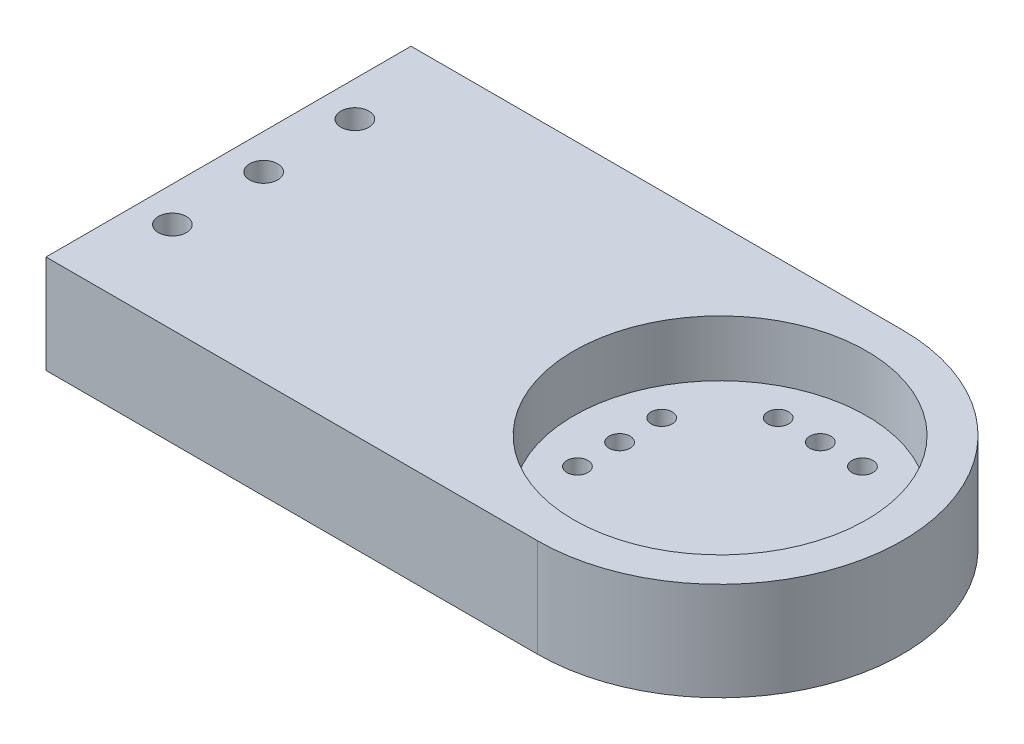
ISO-10303-21;
HEADER;
FILE_DESCRIPTION(('STEP AP214'),'2;1');
FILE_NAME('part.step','',(''),(''),'','','');
FILE_SCHEMA(('AUTOMOTIVE_DESIGN { 1 0 10303 214 1 1 1 1 }'));
ENDSEC;
DATA;
#1=APPLICATION_CONTEXT('core data for automotive mechanical design processes');
#2=APPLICATION_PROTOCOL_DEFINITION('international standard','automotive_design',2000,#1);
#3=PRODUCT_CONTEXT('',#1,'mechanical');
#4=PRODUCT('Part','Part','',(#3));
#5=PRODUCT_RELATED_PRODUCT_CATEGORY('part','',(#4));
#6=PRODUCT_DEFINITION_FORMATION('','',#4);
#7=PRODUCT_DEFINITION_CONTEXT('part definition',#1,'design');
#8=PRODUCT_DEFINITION('design','',#6,#7);
#9=PRODUCT_DEFINITION_SHAPE('','',#8);
#10=(LENGTH_UNIT() NAMED_UNIT(*) SI_UNIT(.MILLI.,.METRE.));
#11=(NAMED_UNIT(*) PLANE_ANGLE_UNIT() SI_UNIT($,.RADIAN.));
#12=(NAMED_UNIT(*) SI_UNIT($,.STERADIAN.) SOLID_ANGLE_UNIT());
#13=UNCERTAINTY_MEASURE_WITH_UNIT(LENGTH_MEASURE(1.E-05),#10,'distance_accuracy_value','');
#14=(GEOMETRIC_REPRESENTATION_CONTEXT(3) GLOBAL_UNCERTAINTY_ASSIGNED_CONTEXT((#13)) GLOBAL_UNIT_ASSIGNED_CONTEXT((#10,
#11,#12)) REPRESENTATION_CONTEXT('',''));
#15=CARTESIAN_POINT('',(0.,0.,0.));
#16=DIRECTION('',(0.,0.,1.));
#17=DIRECTION('',(1.,0.,0.));
#18=AXIS2_PLACEMENT_3D('',#15,#16,#17);
#19=CARTESIAN_POINT('',(0.,0.,0.));
#20=DIRECTION('',(0.,1.,0.));
#21=DIRECTION('',(0.,0.,1.));
#22=AXIS2_PLACEMENT_3D('',#19,#20,#21);
#23=PLANE('',#22);
#24=CARTESIAN_POINT('',(35.,0.,-5.85));
#25=DIRECTION('',(0.,-1.,0.));
#26=DIRECTION('',(0.,0.,-1.));
#27=AXIS2_PLACEMENT_3D('',#24,#25,#26);
#28=CIRCLE('',#27,0.750000000000001);
#29=CARTESIAN_POINT('',(35.,0.,-6.6));
#30=VERTEX_POINT('',#29);
#31=EDGE_CURVE('E439',#30,#30,#28,.T.);
#32=ORIENTED_EDGE('',*,*,#31,.F.);
#33=EDGE_LOOP('',(#32));
#34=FACE_BOUND('',#33,.T.);
#35=CARTESIAN_POINT('',(38.,0.,-5.85));
#36=DIRECTION('',(0.,-1.,0.));
#37=DIRECTION('',(0.,0.,-1.));
#38=AXIS2_PLACEMENT_3D('',#35,#36,#37);
#39=CIRCLE('',#38,0.750000000000001);
#40=CARTESIAN_POINT('',(38.,0.,-6.6));
#41=VERTEX_POINT('',#40);
#42=EDGE_CURVE('E143',#41,#41,#39,.T.);
#43=ORIENTED_EDGE('',*,*,#42,.F.);
#44=EDGE_LOOP('',(#43));
#45=FACE_BOUND('',#44,.T.);
#46=CARTESIAN_POINT('',(32.,0.,-5.85));
#47=DIRECTION('',(0.,-1.,0.));
#48=DIRECTION('',(0.,0.,-1.));
#49=AXIS2_PLACEMENT_3D('',#46,#47,#48);
#50=CIRCLE('',#49,0.750000000000001);
#51=CARTESIAN_POINT('',(32.,0.,-6.6));
#52=VERTEX_POINT('',#51);
#53=EDGE_CURVE('E132',#52,#52,#50,.T.);
#54=ORIENTED_EDGE('',*,*,#53,.F.);
#55=EDGE_LOOP('',(#54));
#56=FACE_BOUND('',#55,.T.);
#57=CARTESIAN_POINT('',(27.85,0.,-10.));
#58=DIRECTION('',(0.,-1.,0.));
#59=DIRECTION('',(0.,0.,-1.));
#60=AXIS2_PLACEMENT_3D('',#57,#58,#59);
#61=CIRCLE('',#60,0.750000000000001);
#62=CARTESIAN_POINT('',(27.85,0.,-10.75));
#63=VERTEX_POINT('',#62);
#64=EDGE_CURVE('E131',#63,#63,#61,.T.);
#65=ORIENTED_EDGE('',*,*,#64,.F.);
#66=EDGE_LOOP('',(#65));
#67=FACE_BOUND('',#66,.T.);
#68=CARTESIAN_POINT('',(27.85,0.,-13.));
#69=DIRECTION('',(0.,-1.,0.));
#70=DIRECTION('',(0.,0.,-1.));
#71=AXIS2_PLACEMENT_3D('',#68,#69,#70);
#72=CIRCLE('',#71,0.750000000000001);
#73=CARTESIAN_POINT('',(27.85,0.,-13.75));
#74=VERTEX_POINT('',#73);
#75=EDGE_CURVE('E149',#74,#74,#72,.T.);
#76=ORIENTED_EDGE('',*,*,#75,.F.);
#77=EDGE_LOOP('',(#76));
#78=FACE_BOUND('',#77,.T.);
#79=CARTESIAN_POINT('',(27.85,0.,-16.));
#80=DIRECTION('',(0.,-1.,0.));
#81=DIRECTION('',(0.,0.,-1.));
#82=AXIS2_PLACEMENT_3D('',#79,#80,#81);
#83=CIRCLE('',#82,0.750000000000001);
#84=CARTESIAN_POINT('',(27.85,0.,-16.75));
#85=VERTEX_POINT('',#84);
#86=EDGE_CURVE('E155',#85,#85,#83,.T.);
#87=ORIENTED_EDGE('',*,*,#86,.F.);
#88=EDGE_LOOP('',(#87));
#89=FACE_BOUND('',#88,.T.);
#90=CARTESIAN_POINT('',(42.15,0.,-13.));
#91=DIRECTION('',(0.,-1.,0.));
#92=DIRECTION('',(0.,0.,-1.));
#93=AXIS2_PLACEMENT_3D('',#90,#91,#92);
#94=CIRCLE('',#93,0.750000000000001);
#95=CARTESIAN_POINT('',(42.15,0.,-13.75));
#96=VERTEX_POINT('',#95);
#97=EDGE_CURVE('E127',#96,#96,#94,.T.);
#98=ORIENTED_EDGE('',*,*,#97,.F.);
#99=EDGE_LOOP('',(#98));
#100=FACE_BOUND('',#99,.T.);
#101=CARTESIAN_POINT('',(42.15,0.,-16.));
#102=DIRECTION('',(0.,-1.,0.));
#103=DIRECTION('',(0.,0.,-1.));
#104=AXIS2_PLACEMENT_3D('',#101,#102,#103);
#105=CIRCLE('',#104,0.750000000000001);
#106=CARTESIAN_POINT('',(42.15,0.,-16.75));
#107=VERTEX_POINT('',#106);
#108=EDGE_CURVE('E168',#107,#107,#105,.T.);
#109=ORIENTED_EDGE('',*,*,#108,.F.);
#110=EDGE_LOOP('',(#109));
#111=FACE_BOUND('',#110,.T.);
#112=CARTESIAN_POINT('',(35.,0.,-20.15));
#113=DIRECTION('',(0.,-1.,0.));
#114=DIRECTION('',(0.,0.,-1.));
#115=AXIS2_PLACEMENT_3D('',#112,#113,#114);
#116=CIRCLE('',#115,0.750000000000001);
#117=CARTESIAN_POINT('',(35.,0.,-20.9));
#118=VERTEX_POINT('',#117);
#119=EDGE_CURVE('E174',#118,#118,#116,.T.);
#120=ORIENTED_EDGE('',*,*,#119,.F.);
#121=EDGE_LOOP('',(#120));
#122=FACE_BOUND('',#121,.T.);
#123=CARTESIAN_POINT('',(32.,0.,-20.15));
#124=DIRECTION('',(0.,-1.,0.));
#125=DIRECTION('',(0.,0.,-1.));
#126=AXIS2_PLACEMENT_3D('',#123,#124,#125);
#127=CIRCLE('',#126,0.750000000000001);
#128=CARTESIAN_POINT('',(32.,0.,-20.9));
#129=VERTEX_POINT('',#128);
#130=EDGE_CURVE('E180',#129,#129,#127,.T.);
#131=ORIENTED_EDGE('',*,*,#130,.F.);
#132=EDGE_LOOP('',(#131));
#133=FACE_BOUND('',#132,.T.);
#134=CARTESIAN_POINT('',(38.,0.,-20.15));
#135=DIRECTION('',(0.,-1.,0.));
#136=DIRECTION('',(0.,0.,-1.));
#137=AXIS2_PLACEMENT_3D('',#134,#135,#136);
#138=CIRCLE('',#137,0.750000000000001);
#139=CARTESIAN_POINT('',(38.,0.,-20.9));
#140=VERTEX_POINT('',#139);
#141=EDGE_CURVE('E186',#140,#140,#138,.T.);
#142=ORIENTED_EDGE('',*,*,#141,.F.);
#143=EDGE_LOOP('',(#142));
#144=FACE_BOUND('',#143,.T.);
#145=CARTESIAN_POINT('',(2.5,0.,-6.5));
#146=DIRECTION('',(0.,-1.,0.));
#147=DIRECTION('',(0.,0.,-1.));
#148=AXIS2_PLACEMENT_3D('',#145,#146,#147);
#149=CIRCLE('',#148,0.999999999999989);
#150=CARTESIAN_POINT('',(2.5,0.,-7.49999999999999));
#151=VERTEX_POINT('',#150);
#152=EDGE_CURVE('E192',#151,#151,#149,.T.);
#153=ORIENTED_EDGE('',*,*,#152,.F.);
#154=EDGE_LOOP('',(#153));
#155=FACE_BOUND('',#154,.T.);
#156=CARTESIAN_POINT('',(2.5,0.,-13.));
#157=DIRECTION('',(0.,-1.,0.));
#158=DIRECTION('',(0.,0.,-1.));
#159=AXIS2_PLACEMENT_3D('',#156,#157,#158);
#160=CIRCLE('',#159,0.999999999999989);
#161=CARTESIAN_POINT('',(2.5,0.,-14.));
#162=VERTEX_POINT('',#161);
#163=EDGE_CURVE('E198',#162,#162,#160,.T.);
#164=ORIENTED_EDGE('',*,*,#163,.F.);
#165=EDGE_LOOP('',(#164));
#166=FACE_BOUND('',#165,.T.);
#167=CARTESIAN_POINT('',(2.5,0.,-19.5));
#168=DIRECTION('',(0.,-1.,0.));
#169=DIRECTION('',(0.,0.,-1.));
#170=AXIS2_PLACEMENT_3D('',#167,#168,#169);
#171=CIRCLE('',#170,0.999999999999989);
#172=CARTESIAN_POINT('',(2.5,0.,-20.5));
#173=VERTEX_POINT('',#172);
#174=EDGE_CURVE('E204',#173,#173,#171,.T.);
#175=ORIENTED_EDGE('',*,*,#174,.F.);
#176=EDGE_LOOP('',(#175));
#177=FACE_BOUND('',#176,.T.);
#178=DIRECTION('',(1.,0.,0.));
#179=VECTOR('',#178,1.);
#180=CARTESIAN_POINT('',(0.,0.,0.));
#181=LINE('',#180,#179);
#182=CARTESIAN_POINT('',(0.,0.,0.));
#183=VERTEX_POINT('',#182);
#184=CARTESIAN_POINT('',(35.,0.,0.));
#185=VERTEX_POINT('',#184);
#186=EDGE_CURVE('E114',#183,#185,#181,.T.);
#187=ORIENTED_EDGE('',*,*,#186,.F.);
#188=DIRECTION('',(0.,0.,-1.));
#189=VECTOR('',#188,1.);
#190=CARTESIAN_POINT('',(0.,0.,0.));
#191=LINE('',#190,#189);
#192=CARTESIAN_POINT('',(0.,0.,-26.));
#193=VERTEX_POINT('',#192);
#194=EDGE_CURVE('E120',#183,#193,#191,.T.);
#195=ORIENTED_EDGE('',*,*,#194,.T.);
#196=DIRECTION('',(1.,0.,0.));
#197=VECTOR('',#196,1.);
#198=CARTESIAN_POINT('',(0.,0.,-26.));
#199=LINE('',#198,#197);
#200=CARTESIAN_POINT('',(35.,0.,-26.));
#201=VERTEX_POINT('',#200);
#202=EDGE_CURVE('E118',#193,#201,#199,.T.);
#203=ORIENTED_EDGE('',*,*,#202,.T.);
#204=CARTESIAN_POINT('',(35.,0.,-13.));
#205=DIRECTION('',(0.,1.,0.));
#206=DIRECTION('',(0.,0.,1.));
#207=AXIS2_PLACEMENT_3D('',#204,#205,#206);
#208=CIRCLE('',#207,13.);
#209=EDGE_CURVE('E104',#185,#201,#208,.T.);
#210=ORIENTED_EDGE('',*,*,#209,.F.);
#211=EDGE_LOOP('',(#187,#195,#203,#210));
#212=FACE_BOUND('',#211,.T.);
#213=CARTESIAN_POINT('',(42.15,0.,-10.));
#214=DIRECTION('',(0.,-1.,0.));
#215=DIRECTION('',(0.,0.,-1.));
#216=AXIS2_PLACEMENT_3D('',#213,#214,#215);
#217=CIRCLE('',#216,0.750000000000001);
#218=CARTESIAN_POINT('',(42.15,0.,-10.75));
#219=VERTEX_POINT('',#218);
#220=EDGE_CURVE('E128',#219,#219,#217,.T.);
#221=ORIENTED_EDGE('',*,*,#220,.F.);
#222=EDGE_LOOP('',(#221));
#223=FACE_BOUND('',#222,.T.);
#224=ADVANCED_FACE('F47',(#34,#45,#56,#67,#78,#89,#100,#111,#122,#133,#144,#155,#166,#177,#212,
#223),#23,.F.);
#225=CARTESIAN_POINT('',(0.,7.,0.));
#226=DIRECTION('',(0.,0.,-1.));
#227=DIRECTION('',(-1.,0.,0.));
#228=AXIS2_PLACEMENT_3D('',#225,#226,#227);
#229=PLANE('',#228);
#230=ORIENTED_EDGE('',*,*,#186,.T.);
#231=DIRECTION('',(0.,-1.,0.));
#232=VECTOR('',#231,1.);
#233=CARTESIAN_POINT('',(35.,7.,0.));
#234=LINE('',#233,#232);
#235=CARTESIAN_POINT('',(35.,7.,0.));
#236=VERTEX_POINT('',#235);
#237=EDGE_CURVE('E11',#236,#185,#234,.T.);
#238=ORIENTED_EDGE('',*,*,#237,.F.);
#239=DIRECTION('',(1.,0.,0.));
#240=VECTOR('',#239,1.);
#241=CARTESIAN_POINT('',(0.,7.,0.));
#242=LINE('',#241,#240);
#243=CARTESIAN_POINT('',(0.,7.,0.));
#244=VERTEX_POINT('',#243);
#245=EDGE_CURVE('E99',#244,#236,#242,.T.);
#246=ORIENTED_EDGE('',*,*,#245,.F.);
#247=DIRECTION('',(0.,-1.,0.));
#248=VECTOR('',#247,1.);
#249=CARTESIAN_POINT('',(0.,7.,0.));
#250=LINE('',#249,#248);
#251=EDGE_CURVE('E66',#244,#183,#250,.T.);
#252=ORIENTED_EDGE('',*,*,#251,.T.);
#253=EDGE_LOOP('',(#230,#238,#246,#252));
#254=FACE_BOUND('',#253,.T.);
#255=ADVANCED_FACE('F49',(#254),#229,.F.);
#256=CARTESIAN_POINT('',(35.,7.,-13.));
#257=DIRECTION('',(0.,-1.,0.));
#258=DIRECTION('',(0.,0.,-1.));
#259=AXIS2_PLACEMENT_3D('',#256,#257,#258);
#260=CYLINDRICAL_SURFACE('',#259,13.);
#261=ORIENTED_EDGE('',*,*,#209,.T.);
#262=DIRECTION('',(0.,-1.,0.));
#263=VECTOR('',#262,1.);
#264=CARTESIAN_POINT('',(35.,7.,-26.));
#265=LINE('',#264,#263);
#266=CARTESIAN_POINT('',(35.,7.,-26.));
#267=VERTEX_POINT('',#266);
#268=EDGE_CURVE('E57',#267,#201,#265,.T.);
#269=ORIENTED_EDGE('',*,*,#268,.F.);
#270=CARTESIAN_POINT('',(35.,7.,-13.));
#271=DIRECTION('',(0.,1.,0.));
#272=DIRECTION('',(0.,0.,1.));
#273=AXIS2_PLACEMENT_3D('',#270,#271,#272);
#274=CIRCLE('',#273,13.);
#275=EDGE_CURVE('E91',#236,#267,#274,.T.);
#276=ORIENTED_EDGE('',*,*,#275,.F.);
#277=ORIENTED_EDGE('',*,*,#237,.T.);
#278=EDGE_LOOP('',(#261,#269,#276,#277));
#279=FACE_BOUND('',#278,.T.);
#280=ADVANCED_FACE('F103',(#279),#260,.T.);
#281=CARTESIAN_POINT('',(0.,7.,-26.));
#282=DIRECTION('',(0.,0.,-1.));
#283=DIRECTION('',(-1.,0.,0.));
#284=AXIS2_PLACEMENT_3D('',#281,#282,#283);
#285=PLANE('',#284);
#286=ORIENTED_EDGE('',*,*,#202,.F.);
#287=DIRECTION('',(0.,-1.,0.));
#288=VECTOR('',#287,1.);
#289=CARTESIAN_POINT('',(0.,7.,-26.));
#290=LINE('',#289,#288);
#291=CARTESIAN_POINT('',(0.,7.,-26.));
#292=VERTEX_POINT('',#291);
#293=EDGE_CURVE('E80',#292,#193,#290,.T.);
#294=ORIENTED_EDGE('',*,*,#293,.F.);
#295=DIRECTION('',(1.,0.,0.));
#296=VECTOR('',#295,1.);
#297=CARTESIAN_POINT('',(0.,7.,-26.));
#298=LINE('',#297,#296);
#299=EDGE_CURVE('E98',#292,#267,#298,.T.);
#300=ORIENTED_EDGE('',*,*,#299,.T.);
#301=ORIENTED_EDGE('',*,*,#268,.T.);
#302=EDGE_LOOP('',(#286,#294,#300,#301));
#303=FACE_BOUND('',#302,.T.);
#304=ADVANCED_FACE('F108',(#303),#285,.T.);
#305=CARTESIAN_POINT('',(0.,7.,0.));
#306=DIRECTION('',(-1.,0.,0.));
#307=DIRECTION('',(0.,0.,1.));
#308=AXIS2_PLACEMENT_3D('',#305,#306,#307);
#309=PLANE('',#308);
#310=ORIENTED_EDGE('',*,*,#194,.F.);
#311=ORIENTED_EDGE('',*,*,#251,.F.);
#312=DIRECTION('',(0.,0.,-1.));
#313=VECTOR('',#312,1.);
#314=CARTESIAN_POINT('',(0.,7.,0.));
#315=LINE('',#314,#313);
#316=EDGE_CURVE('E109',#244,#292,#315,.T.);
#317=ORIENTED_EDGE('',*,*,#316,.T.);
#318=ORIENTED_EDGE('',*,*,#293,.T.);
#319=EDGE_LOOP('',(#310,#311,#317,#318));
#320=FACE_BOUND('',#319,.T.);
#321=ADVANCED_FACE('F219',(#320),#309,.T.);
#322=CARTESIAN_POINT('',(0.,7.,0.));
#323=DIRECTION('',(0.,1.,0.));
#324=DIRECTION('',(0.,0.,1.));
#325=AXIS2_PLACEMENT_3D('',#322,#323,#324);
#326=PLANE('',#325);
#327=CARTESIAN_POINT('',(2.5,6.99999999999999,-6.5));
#328=DIRECTION('',(0.,-1.,0.));
#329=DIRECTION('',(0.,0.,-1.));
#330=AXIS2_PLACEMENT_3D('',#327,#328,#329);
#331=CIRCLE('',#330,0.999999999999987);
#332=CARTESIAN_POINT('',(2.5,6.99999999999999,-7.49999999999999));
#333=VERTEX_POINT('',#332);
#334=EDGE_CURVE('E195',#333,#333,#331,.T.);
#335=ORIENTED_EDGE('',*,*,#334,.T.);
#336=EDGE_LOOP('',(#335));
#337=FACE_BOUND('',#336,.T.);
#338=CARTESIAN_POINT('',(2.5,6.99999999999999,-13.));
#339=DIRECTION('',(0.,-1.,0.));
#340=DIRECTION('',(0.,0.,-1.));
#341=AXIS2_PLACEMENT_3D('',#338,#339,#340);
#342=CIRCLE('',#341,0.999999999999987);
#343=CARTESIAN_POINT('',(2.5,6.99999999999999,-14.));
#344=VERTEX_POINT('',#343);
#345=EDGE_CURVE('E201',#344,#344,#342,.T.);
#346=ORIENTED_EDGE('',*,*,#345,.T.);
#347=EDGE_LOOP('',(#346));
#348=FACE_BOUND('',#347,.T.);
#349=CARTESIAN_POINT('',(2.5,6.99999999999999,-19.5));
#350=DIRECTION('',(0.,-1.,0.));
#351=DIRECTION('',(0.,0.,-1.));
#352=AXIS2_PLACEMENT_3D('',#349,#350,#351);
#353=CIRCLE('',#352,0.999999999999987);
#354=CARTESIAN_POINT('',(2.5,6.99999999999999,-20.5));
#355=VERTEX_POINT('',#354);
#356=EDGE_CURVE('E207',#355,#355,#353,.T.);
#357=ORIENTED_EDGE('',*,*,#356,.T.);
#358=EDGE_LOOP('',(#357));
#359=FACE_BOUND('',#358,.T.);
#360=CARTESIAN_POINT('',(35.0112333506112,7.,-13.0014825212493));
#361=DIRECTION('',(0.,1.,0.));
#362=DIRECTION('',(0.,0.,1.));
#363=AXIS2_PLACEMENT_3D('',#360,#361,#362);
#364=CIRCLE('',#363,10.425);
#365=CARTESIAN_POINT('',(35.0112333506112,7.,-2.57648252124927));
#366=VERTEX_POINT('',#365);
#367=EDGE_CURVE('E210',#366,#366,#364,.T.);
#368=ORIENTED_EDGE('',*,*,#367,.F.);
#369=EDGE_LOOP('',(#368));
#370=FACE_BOUND('',#369,.T.);
#371=ORIENTED_EDGE('',*,*,#245,.T.);
#372=ORIENTED_EDGE('',*,*,#275,.T.);
#373=ORIENTED_EDGE('',*,*,#299,.F.);
#374=ORIENTED_EDGE('',*,*,#316,.F.);
#375=EDGE_LOOP('',(#371,#372,#373,#374));
#376=FACE_BOUND('',#375,.T.);
#377=ADVANCED_FACE('F95',(#337,#348,#359,#370,#376),#326,.T.);
#378=CARTESIAN_POINT('',(35.0112333506112,3.,-13.0014825212493));
#379=DIRECTION('',(0.,1.,0.));
#380=DIRECTION('',(0.,0.,1.));
#381=AXIS2_PLACEMENT_3D('',#378,#379,#380);
#382=CYLINDRICAL_SURFACE('',#381,10.425);
#383=CARTESIAN_POINT('',(35.0112333506112,3.,-13.0014825212493));
#384=DIRECTION('',(0.,1.,0.));
#385=DIRECTION('',(0.,0.,1.));
#386=AXIS2_PLACEMENT_3D('',#383,#384,#385);
#387=CIRCLE('',#386,10.425);
#388=CARTESIAN_POINT('',(35.0112333506112,3.,-2.57648252124927));
#389=VERTEX_POINT('',#388);
#390=EDGE_CURVE('E116',#389,#389,#387,.T.);
#391=ORIENTED_EDGE('',*,*,#390,.F.);
#392=EDGE_LOOP('',(#391));
#393=FACE_BOUND('',#392,.T.);
#394=ORIENTED_EDGE('',*,*,#367,.T.);
#395=EDGE_LOOP('',(#394));
#396=FACE_BOUND('',#395,.T.);
#397=ADVANCED_FACE('F216',(#393,#396),#382,.F.);
#398=CARTESIAN_POINT('',(35.0112333506112,3.,-13.0014825212493));
#399=DIRECTION('',(0.,1.,0.));
#400=DIRECTION('',(0.,0.,1.));
#401=AXIS2_PLACEMENT_3D('',#398,#399,#400);
#402=PLANE('',#401);
#403=CARTESIAN_POINT('',(35.,3.,-5.85));
#404=DIRECTION('',(0.,1.,0.));
#405=DIRECTION('',(0.,0.,1.));
#406=AXIS2_PLACEMENT_3D('',#403,#404,#405);
#407=CIRCLE('',#406,0.750000000000001);
#408=CARTESIAN_POINT('',(35.,3.,-5.1));
#409=VERTEX_POINT('',#408);
#410=EDGE_CURVE('E437',#409,#409,#407,.T.);
#411=ORIENTED_EDGE('',*,*,#410,.F.);
#412=EDGE_LOOP('',(#411));
#413=FACE_BOUND('',#412,.T.);
#414=CARTESIAN_POINT('',(38.,3.,-5.85));
#415=DIRECTION('',(0.,1.,0.));
#416=DIRECTION('',(0.,0.,1.));
#417=AXIS2_PLACEMENT_3D('',#414,#415,#416);
#418=CIRCLE('',#417,0.750000000000001);
#419=CARTESIAN_POINT('',(38.,3.,-5.1));
#420=VERTEX_POINT('',#419);
#421=EDGE_CURVE('E51',#420,#420,#418,.T.);
#422=ORIENTED_EDGE('',*,*,#421,.F.);
#423=EDGE_LOOP('',(#422));
#424=FACE_BOUND('',#423,.T.);
#425=CARTESIAN_POINT('',(32.,3.,-5.85));
#426=DIRECTION('',(0.,1.,0.));
#427=DIRECTION('',(0.,0.,1.));
#428=AXIS2_PLACEMENT_3D('',#425,#426,#427);
#429=CIRCLE('',#428,0.750000000000001);
#430=CARTESIAN_POINT('',(32.,3.,-5.1));
#431=VERTEX_POINT('',#430);
#432=EDGE_CURVE('E129',#431,#431,#429,.T.);
#433=ORIENTED_EDGE('',*,*,#432,.F.);
#434=EDGE_LOOP('',(#433));
#435=FACE_BOUND('',#434,.T.);
#436=CARTESIAN_POINT('',(27.85,3.,-10.));
#437=DIRECTION('',(0.,1.,0.));
#438=DIRECTION('',(0.,0.,1.));
#439=AXIS2_PLACEMENT_3D('',#436,#437,#438);
#440=CIRCLE('',#439,0.749999999999999);
#441=CARTESIAN_POINT('',(27.85,3.,-9.25));
#442=VERTEX_POINT('',#441);
#443=EDGE_CURVE('E136',#442,#442,#440,.T.);
#444=ORIENTED_EDGE('',*,*,#443,.F.);
#445=EDGE_LOOP('',(#444));
#446=FACE_BOUND('',#445,.T.);
#447=CARTESIAN_POINT('',(27.85,3.,-13.));
#448=DIRECTION('',(0.,1.,0.));
#449=DIRECTION('',(0.,0.,1.));
#450=AXIS2_PLACEMENT_3D('',#447,#448,#449);
#451=CIRCLE('',#450,0.749999999999999);
#452=CARTESIAN_POINT('',(27.85,3.,-12.25));
#453=VERTEX_POINT('',#452);
#454=EDGE_CURVE('E152',#453,#453,#451,.T.);
#455=ORIENTED_EDGE('',*,*,#454,.F.);
#456=EDGE_LOOP('',(#455));
#457=FACE_BOUND('',#456,.T.);
#458=CARTESIAN_POINT('',(27.85,3.,-16.));
#459=DIRECTION('',(0.,1.,0.));
#460=DIRECTION('',(0.,0.,1.));
#461=AXIS2_PLACEMENT_3D('',#458,#459,#460);
#462=CIRCLE('',#461,0.749999999999999);
#463=CARTESIAN_POINT('',(27.85,3.,-15.25));
#464=VERTEX_POINT('',#463);
#465=EDGE_CURVE('E158',#464,#464,#462,.T.);
#466=ORIENTED_EDGE('',*,*,#465,.F.);
#467=EDGE_LOOP('',(#466));
#468=FACE_BOUND('',#467,.T.);
#469=CARTESIAN_POINT('',(42.15,3.,-10.));
#470=DIRECTION('',(0.,1.,0.));
#471=DIRECTION('',(0.,0.,1.));
#472=AXIS2_PLACEMENT_3D('',#469,#470,#471);
#473=CIRCLE('',#472,0.750000000000001);
#474=CARTESIAN_POINT('',(42.15,3.,-9.25));
#475=VERTEX_POINT('',#474);
#476=EDGE_CURVE('E125',#475,#475,#473,.T.);
#477=ORIENTED_EDGE('',*,*,#476,.F.);
#478=EDGE_LOOP('',(#477));
#479=FACE_BOUND('',#478,.T.);
#480=CARTESIAN_POINT('',(42.15,3.,-13.));
#481=DIRECTION('',(0.,1.,0.));
#482=DIRECTION('',(0.,0.,1.));
#483=AXIS2_PLACEMENT_3D('',#480,#481,#482);
#484=CIRCLE('',#483,0.750000000000001);
#485=CARTESIAN_POINT('',(42.15,3.,-12.25));
#486=VERTEX_POINT('',#485);
#487=EDGE_CURVE('E165',#486,#486,#484,.T.);
#488=ORIENTED_EDGE('',*,*,#487,.F.);
#489=EDGE_LOOP('',(#488));
#490=FACE_BOUND('',#489,.T.);
#491=CARTESIAN_POINT('',(42.15,3.,-16.));
#492=DIRECTION('',(0.,1.,0.));
#493=DIRECTION('',(0.,0.,1.));
#494=AXIS2_PLACEMENT_3D('',#491,#492,#493);
#495=CIRCLE('',#494,0.750000000000001);
#496=CARTESIAN_POINT('',(42.15,3.,-15.25));
#497=VERTEX_POINT('',#496);
#498=EDGE_CURVE('E171',#497,#497,#495,.T.);
#499=ORIENTED_EDGE('',*,*,#498,.F.);
#500=EDGE_LOOP('',(#499));
#501=FACE_BOUND('',#500,.T.);
#502=CARTESIAN_POINT('',(35.,3.,-20.15));
#503=DIRECTION('',(0.,1.,0.));
#504=DIRECTION('',(0.,0.,1.));
#505=AXIS2_PLACEMENT_3D('',#502,#503,#504);
#506=CIRCLE('',#505,0.750000000000001);
#507=CARTESIAN_POINT('',(35.,3.,-19.4));
#508=VERTEX_POINT('',#507);
#509=EDGE_CURVE('E177',#508,#508,#506,.T.);
#510=ORIENTED_EDGE('',*,*,#509,.F.);
#511=EDGE_LOOP('',(#510));
#512=FACE_BOUND('',#511,.T.);
#513=CARTESIAN_POINT('',(32.,3.,-20.15));
#514=DIRECTION('',(0.,1.,0.));
#515=DIRECTION('',(0.,0.,1.));
#516=AXIS2_PLACEMENT_3D('',#513,#514,#515);
#517=CIRCLE('',#516,0.750000000000001);
#518=CARTESIAN_POINT('',(32.,3.,-19.4));
#519=VERTEX_POINT('',#518);
#520=EDGE_CURVE('E183',#519,#519,#517,.T.);
#521=ORIENTED_EDGE('',*,*,#520,.F.);
#522=EDGE_LOOP('',(#521));
#523=FACE_BOUND('',#522,.T.);
#524=CARTESIAN_POINT('',(38.,3.,-20.15));
#525=DIRECTION('',(0.,1.,0.));
#526=DIRECTION('',(0.,0.,1.));
#527=AXIS2_PLACEMENT_3D('',#524,#525,#526);
#528=CIRCLE('',#527,0.750000000000001);
#529=CARTESIAN_POINT('',(38.,3.,-19.4));
#530=VERTEX_POINT('',#529);
#531=EDGE_CURVE('E189',#530,#530,#528,.T.);
#532=ORIENTED_EDGE('',*,*,#531,.F.);
#533=EDGE_LOOP('',(#532));
#534=FACE_BOUND('',#533,.T.);
#535=ORIENTED_EDGE('',*,*,#390,.T.);
#536=EDGE_LOOP('',(#535));
#537=FACE_BOUND('',#536,.T.);
#538=ADVANCED_FACE('F226',(#413,#424,#435,#446,#457,#468,#479,#490,#501,#512,#523,#534,#537),
#402,.T.);
#539=CARTESIAN_POINT('',(2.5,0.,-19.5));
#540=DIRECTION('',(0.,-1.,0.));
#541=DIRECTION('',(0.,0.,-1.));
#542=AXIS2_PLACEMENT_3D('',#539,#540,#541);
#543=CYLINDRICAL_SURFACE('',#542,0.999999999999988);
#544=ORIENTED_EDGE('',*,*,#356,.F.);
#545=EDGE_LOOP('',(#544));
#546=FACE_BOUND('',#545,.T.);
#547=ORIENTED_EDGE('',*,*,#174,.T.);
#548=EDGE_LOOP('',(#547));
#549=FACE_BOUND('',#548,.T.);
#550=ADVANCED_FACE('F277',(#546,#549),#543,.F.);
#551=CARTESIAN_POINT('',(2.5,0.,-13.));
#552=DIRECTION('',(0.,-1.,0.));
#553=DIRECTION('',(0.,0.,-1.));
#554=AXIS2_PLACEMENT_3D('',#551,#552,#553);
#555=CYLINDRICAL_SURFACE('',#554,0.999999999999988);
#556=ORIENTED_EDGE('',*,*,#345,.F.);
#557=EDGE_LOOP('',(#556));
#558=FACE_BOUND('',#557,.T.);
#559=ORIENTED_EDGE('',*,*,#163,.T.);
#560=EDGE_LOOP('',(#559));
#561=FACE_BOUND('',#560,.T.);
#562=ADVANCED_FACE('F287',(#558,#561),#555,.F.);
#563=CARTESIAN_POINT('',(2.5,0.,-6.5));
#564=DIRECTION('',(0.,-1.,0.));
#565=DIRECTION('',(0.,0.,-1.));
#566=AXIS2_PLACEMENT_3D('',#563,#564,#565);
#567=CYLINDRICAL_SURFACE('',#566,0.999999999999988);
#568=ORIENTED_EDGE('',*,*,#334,.F.);
#569=EDGE_LOOP('',(#568));
#570=FACE_BOUND('',#569,.T.);
#571=ORIENTED_EDGE('',*,*,#152,.T.);
#572=EDGE_LOOP('',(#571));
#573=FACE_BOUND('',#572,.T.);
#574=ADVANCED_FACE('F297',(#570,#573),#567,.F.);
#575=CARTESIAN_POINT('',(38.,0.,-20.15));
#576=DIRECTION('',(0.,-1.,0.));
#577=DIRECTION('',(0.,0.,-1.));
#578=AXIS2_PLACEMENT_3D('',#575,#576,#577);
#579=CYLINDRICAL_SURFACE('',#578,0.750000000000001);
#580=ORIENTED_EDGE('',*,*,#531,.T.);
#581=EDGE_LOOP('',(#580));
#582=FACE_BOUND('',#581,.T.);
#583=ORIENTED_EDGE('',*,*,#141,.T.);
#584=EDGE_LOOP('',(#583));
#585=FACE_BOUND('',#584,.T.);
#586=ADVANCED_FACE('F306',(#582,#585),#579,.F.);
#587=CARTESIAN_POINT('',(32.,0.,-20.15));
#588=DIRECTION('',(0.,-1.,0.));
#589=DIRECTION('',(0.,0.,-1.));
#590=AXIS2_PLACEMENT_3D('',#587,#588,#589);
#591=CYLINDRICAL_SURFACE('',#590,0.750000000000001);
#592=ORIENTED_EDGE('',*,*,#520,.T.);
#593=EDGE_LOOP('',(#592));
#594=FACE_BOUND('',#593,.T.);
#595=ORIENTED_EDGE('',*,*,#130,.T.);
#596=EDGE_LOOP('',(#595));
#597=FACE_BOUND('',#596,.T.);
#598=ADVANCED_FACE('F322',(#594,#597),#591,.F.);
#599=CARTESIAN_POINT('',(35.,0.,-20.15));
#600=DIRECTION('',(0.,-1.,0.));
#601=DIRECTION('',(0.,0.,-1.));
#602=AXIS2_PLACEMENT_3D('',#599,#600,#601);
#603=CYLINDRICAL_SURFACE('',#602,0.750000000000001);
#604=ORIENTED_EDGE('',*,*,#509,.T.);
#605=EDGE_LOOP('',(#604));
#606=FACE_BOUND('',#605,.T.);
#607=ORIENTED_EDGE('',*,*,#119,.T.);
#608=EDGE_LOOP('',(#607));
#609=FACE_BOUND('',#608,.T.);
#610=ADVANCED_FACE('F332',(#606,#609),#603,.F.);
#611=CARTESIAN_POINT('',(42.15,0.,-16.));
#612=DIRECTION('',(0.,-1.,0.));
#613=DIRECTION('',(0.,0.,-1.));
#614=AXIS2_PLACEMENT_3D('',#611,#612,#613);
#615=CYLINDRICAL_SURFACE('',#614,0.750000000000001);
#616=ORIENTED_EDGE('',*,*,#498,.T.);
#617=EDGE_LOOP('',(#616));
#618=FACE_BOUND('',#617,.T.);
#619=ORIENTED_EDGE('',*,*,#108,.T.);
#620=EDGE_LOOP('',(#619));
#621=FACE_BOUND('',#620,.T.);
#622=ADVANCED_FACE('F342',(#618,#621),#615,.F.);
#623=CARTESIAN_POINT('',(42.15,0.,-13.));
#624=DIRECTION('',(0.,-1.,0.));
#625=DIRECTION('',(0.,0.,-1.));
#626=AXIS2_PLACEMENT_3D('',#623,#624,#625);
#627=CYLINDRICAL_SURFACE('',#626,0.750000000000001);
#628=ORIENTED_EDGE('',*,*,#487,.T.);
#629=EDGE_LOOP('',(#628));
#630=FACE_BOUND('',#629,.T.);
#631=ORIENTED_EDGE('',*,*,#97,.T.);
#632=EDGE_LOOP('',(#631));
#633=FACE_BOUND('',#632,.T.);
#634=ADVANCED_FACE('F352',(#630,#633),#627,.F.);
#635=CARTESIAN_POINT('',(42.15,0.,-10.));
#636=DIRECTION('',(0.,-1.,0.));
#637=DIRECTION('',(0.,0.,-1.));
#638=AXIS2_PLACEMENT_3D('',#635,#636,#637);
#639=CYLINDRICAL_SURFACE('',#638,0.750000000000001);
#640=ORIENTED_EDGE('',*,*,#476,.T.);
#641=EDGE_LOOP('',(#640));
#642=FACE_BOUND('',#641,.T.);
#643=ORIENTED_EDGE('',*,*,#220,.T.);
#644=EDGE_LOOP('',(#643));
#645=FACE_BOUND('',#644,.T.);
#646=ADVANCED_FACE('F362',(#642,#645),#639,.F.);
#647=CARTESIAN_POINT('',(27.85,0.,-16.));
#648=DIRECTION('',(0.,-1.,0.));
#649=DIRECTION('',(0.,0.,-1.));
#650=AXIS2_PLACEMENT_3D('',#647,#648,#649);
#651=CYLINDRICAL_SURFACE('',#650,0.749999999999999);
#652=ORIENTED_EDGE('',*,*,#465,.T.);
#653=EDGE_LOOP('',(#652));
#654=FACE_BOUND('',#653,.T.);
#655=ORIENTED_EDGE('',*,*,#86,.T.);
#656=EDGE_LOOP('',(#655));
#657=FACE_BOUND('',#656,.T.);
#658=ADVANCED_FACE('F372',(#654,#657),#651,.F.);
#659=CARTESIAN_POINT('',(27.85,0.,-13.));
#660=DIRECTION('',(0.,-1.,0.));
#661=DIRECTION('',(0.,0.,-1.));
#662=AXIS2_PLACEMENT_3D('',#659,#660,#661);
#663=CYLINDRICAL_SURFACE('',#662,0.749999999999999);
#664=ORIENTED_EDGE('',*,*,#454,.T.);
#665=EDGE_LOOP('',(#664));
#666=FACE_BOUND('',#665,.T.);
#667=ORIENTED_EDGE('',*,*,#75,.T.);
#668=EDGE_LOOP('',(#667));
#669=FACE_BOUND('',#668,.T.);
#670=ADVANCED_FACE('F382',(#666,#669),#663,.F.);
#671=CARTESIAN_POINT('',(27.85,0.,-10.));
#672=DIRECTION('',(0.,-1.,0.));
#673=DIRECTION('',(0.,0.,-1.));
#674=AXIS2_PLACEMENT_3D('',#671,#672,#673);
#675=CYLINDRICAL_SURFACE('',#674,0.749999999999999);
#676=ORIENTED_EDGE('',*,*,#443,.T.);
#677=EDGE_LOOP('',(#676));
#678=FACE_BOUND('',#677,.T.);
#679=ORIENTED_EDGE('',*,*,#64,.T.);
#680=EDGE_LOOP('',(#679));
#681=FACE_BOUND('',#680,.T.);
#682=ADVANCED_FACE('F392',(#678,#681),#675,.F.);
#683=CARTESIAN_POINT('',(32.,0.,-5.85));
#684=DIRECTION('',(0.,-1.,0.));
#685=DIRECTION('',(0.,0.,-1.));
#686=AXIS2_PLACEMENT_3D('',#683,#684,#685);
#687=CYLINDRICAL_SURFACE('',#686,0.750000000000001);
#688=ORIENTED_EDGE('',*,*,#432,.T.);
#689=EDGE_LOOP('',(#688));
#690=FACE_BOUND('',#689,.T.);
#691=ORIENTED_EDGE('',*,*,#53,.T.);
#692=EDGE_LOOP('',(#691));
#693=FACE_BOUND('',#692,.T.);
#694=ADVANCED_FACE('F402',(#690,#693),#687,.F.);
#695=CARTESIAN_POINT('',(38.,0.,-5.85));
#696=DIRECTION('',(0.,-1.,0.));
#697=DIRECTION('',(0.,0.,-1.));
#698=AXIS2_PLACEMENT_3D('',#695,#696,#697);
#699=CYLINDRICAL_SURFACE('',#698,0.750000000000001);
#700=ORIENTED_EDGE('',*,*,#421,.T.);
#701=EDGE_LOOP('',(#700));
#702=FACE_BOUND('',#701,.T.);
#703=ORIENTED_EDGE('',*,*,#42,.T.);
#704=EDGE_LOOP('',(#703));
#705=FACE_BOUND('',#704,.T.);
#706=ADVANCED_FACE('F412',(#702,#705),#699,.F.);
#707=CARTESIAN_POINT('',(35.,0.,-5.85));
#708=DIRECTION('',(0.,-1.,0.));
#709=DIRECTION('',(0.,0.,-1.));
#710=AXIS2_PLACEMENT_3D('',#707,#708,#709);
#711=CYLINDRICAL_SURFACE('',#710,0.750000000000001);
#712=ORIENTED_EDGE('',*,*,#410,.T.);
#713=EDGE_LOOP('',(#712));
#714=FACE_BOUND('',#713,.T.);
#715=ORIENTED_EDGE('',*,*,#31,.T.);
#716=EDGE_LOOP('',(#715));
#717=FACE_BOUND('',#716,.T.);
#718=ADVANCED_FACE('F421',(#714,#717),#711,.F.);
#719=CLOSED_SHELL('',(#224,#255,#280,#304,#321,#377,#397,#538,#550,#562,#574,#586,#598,#610,
#622,#634,#646,#658,#670,#682,#694,#706,#718));
#720=MANIFOLD_SOLID_BREP('B2',#719);
#721=ADVANCED_BREP_SHAPE_REPRESENTATION('',(#18,#720),#14);
#722=SHAPE_DEFINITION_REPRESENTATION(#9,#721);
ENDSEC;
END-ISO-10303-21;
